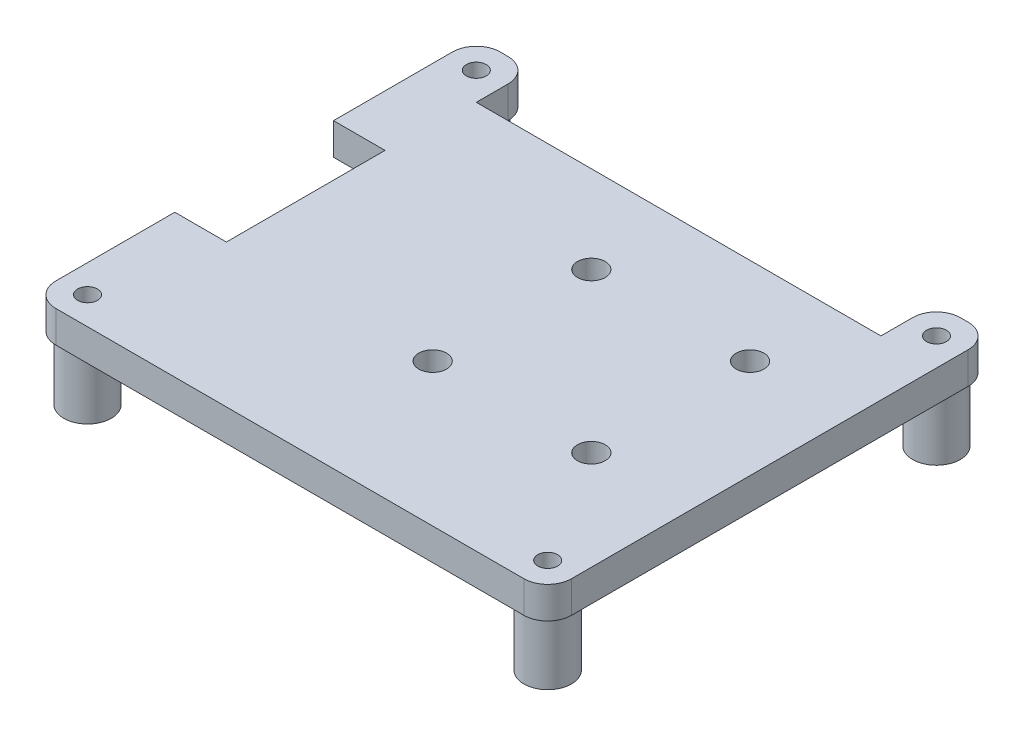
ISO-10303-21;
HEADER;
FILE_DESCRIPTION(('STEP AP214'),'2;1');
FILE_NAME('part.step','',(''),(''),'','','');
FILE_SCHEMA(('AUTOMOTIVE_DESIGN { 1 0 10303 214 1 1 1 1 }'));
ENDSEC;
DATA;
#1=APPLICATION_CONTEXT('core data for automotive mechanical design processes');
#2=APPLICATION_PROTOCOL_DEFINITION('international standard','automotive_design',2000,#1);
#3=PRODUCT_CONTEXT('',#1,'mechanical');
#4=PRODUCT('Part','Part','',(#3));
#5=PRODUCT_RELATED_PRODUCT_CATEGORY('part','',(#4));
#6=PRODUCT_DEFINITION_FORMATION('','',#4);
#7=PRODUCT_DEFINITION_CONTEXT('part definition',#1,'design');
#8=PRODUCT_DEFINITION('design','',#6,#7);
#9=PRODUCT_DEFINITION_SHAPE('','',#8);
#10=(LENGTH_UNIT() NAMED_UNIT(*) SI_UNIT(.MILLI.,.METRE.));
#11=(NAMED_UNIT(*) PLANE_ANGLE_UNIT() SI_UNIT($,.RADIAN.));
#12=(NAMED_UNIT(*) SI_UNIT($,.STERADIAN.) SOLID_ANGLE_UNIT());
#13=UNCERTAINTY_MEASURE_WITH_UNIT(LENGTH_MEASURE(1.E-05),#10,'distance_accuracy_value','');
#14=(GEOMETRIC_REPRESENTATION_CONTEXT(3) GLOBAL_UNCERTAINTY_ASSIGNED_CONTEXT((#13)) GLOBAL_UNIT_ASSIGNED_CONTEXT((#10,
#11,#12)) REPRESENTATION_CONTEXT('',''));
#15=CARTESIAN_POINT('',(0.,0.,0.));
#16=DIRECTION('',(0.,0.,1.));
#17=DIRECTION('',(1.,0.,0.));
#18=AXIS2_PLACEMENT_3D('',#15,#16,#17);
#19=CARTESIAN_POINT('',(0.,0.,0.));
#20=DIRECTION('',(0.,-1.,0.));
#21=DIRECTION('',(0.,0.,-1.));
#22=AXIS2_PLACEMENT_3D('',#19,#20,#21);
#23=PLANE('',#22);
#24=CARTESIAN_POINT('',(32.3632285890982,0.,-28.7197204695631));
#25=DIRECTION('',(0.,-1.,0.));
#26=DIRECTION('',(0.,0.,-1.));
#27=AXIS2_PLACEMENT_3D('',#24,#25,#26);
#28=CIRCLE('',#27,3.);
#29=CARTESIAN_POINT('',(32.3632285890982,0.,-31.7197204695631));
#30=VERTEX_POINT('',#29);
#31=EDGE_CURVE('E454',#30,#30,#28,.T.);
#32=ORIENTED_EDGE('',*,*,#31,.F.);
#33=EDGE_LOOP('',(#32));
#34=FACE_BOUND('',#33,.T.);
#35=CARTESIAN_POINT('',(-25.6367714109018,0.,20.2802795304369));
#36=DIRECTION('',(0.,-1.,0.));
#37=DIRECTION('',(0.,0.,-1.));
#38=AXIS2_PLACEMENT_3D('',#35,#36,#37);
#39=CIRCLE('',#38,3.);
#40=CARTESIAN_POINT('',(-25.6367714109018,0.,17.2802795304369));
#41=VERTEX_POINT('',#40);
#42=EDGE_CURVE('E427',#41,#41,#39,.T.);
#43=ORIENTED_EDGE('',*,*,#42,.F.);
#44=EDGE_LOOP('',(#43));
#45=FACE_BOUND('',#44,.T.);
#46=CARTESIAN_POINT('',(23.3632285890982,0.,5.78027953043689));
#47=DIRECTION('',(0.,1.,0.));
#48=DIRECTION('',(0.,0.,1.));
#49=AXIS2_PLACEMENT_3D('',#46,#47,#48);
#50=CIRCLE('',#49,1.75);
#51=CARTESIAN_POINT('',(23.3632285890982,0.,7.53027953043689));
#52=VERTEX_POINT('',#51);
#53=EDGE_CURVE('E403',#52,#52,#50,.T.);
#54=ORIENTED_EDGE('',*,*,#53,.T.);
#55=EDGE_LOOP('',(#54));
#56=FACE_BOUND('',#55,.T.);
#57=CARTESIAN_POINT('',(3.36322858909823,0.,5.7802795304369));
#58=DIRECTION('',(0.,1.,0.));
#59=DIRECTION('',(0.,0.,1.));
#60=AXIS2_PLACEMENT_3D('',#57,#58,#59);
#61=CIRCLE('',#60,1.75);
#62=CARTESIAN_POINT('',(3.36322858909823,0.,7.5302795304369));
#63=VERTEX_POINT('',#62);
#64=EDGE_CURVE('E412',#63,#63,#61,.T.);
#65=ORIENTED_EDGE('',*,*,#64,.T.);
#66=EDGE_LOOP('',(#65));
#67=FACE_BOUND('',#66,.T.);
#68=CARTESIAN_POINT('',(3.36322858909823,0.,-14.2197204695631));
#69=DIRECTION('',(0.,1.,0.));
#70=DIRECTION('',(0.,0.,1.));
#71=AXIS2_PLACEMENT_3D('',#68,#69,#70);
#72=CIRCLE('',#71,1.75);
#73=CARTESIAN_POINT('',(3.36322858909823,0.,-12.4697204695631));
#74=VERTEX_POINT('',#73);
#75=EDGE_CURVE('E420',#74,#74,#72,.T.);
#76=ORIENTED_EDGE('',*,*,#75,.T.);
#77=EDGE_LOOP('',(#76));
#78=FACE_BOUND('',#77,.T.);
#79=CARTESIAN_POINT('',(23.3632285890982,0.,-14.2197204695631));
#80=DIRECTION('',(0.,1.,0.));
#81=DIRECTION('',(0.,0.,1.));
#82=AXIS2_PLACEMENT_3D('',#79,#80,#81);
#83=CIRCLE('',#82,1.75);
#84=CARTESIAN_POINT('',(23.3632285890982,0.,-12.4697204695631));
#85=VERTEX_POINT('',#84);
#86=EDGE_CURVE('E394',#85,#85,#83,.T.);
#87=ORIENTED_EDGE('',*,*,#86,.T.);
#88=EDGE_LOOP('',(#87));
#89=FACE_BOUND('',#88,.T.);
#90=DIRECTION('',(0.,0.,1.));
#91=VECTOR('',#90,1.);
#92=CARTESIAN_POINT('',(28.8632285890982,0.,-32.2197204695631));
#93=LINE('',#92,#91);
#94=CARTESIAN_POINT('',(28.8632285890982,0.,-29.2197204695631));
#95=VERTEX_POINT('',#94);
#96=CARTESIAN_POINT('',(28.8632285890982,0.,-25.2197204695631));
#97=VERTEX_POINT('',#96);
#98=EDGE_CURVE('E270',#95,#97,#93,.T.);
#99=ORIENTED_EDGE('',*,*,#98,.F.);
#100=CARTESIAN_POINT('',(31.8632285890982,0.,-29.2197204695631));
#101=DIRECTION('',(0.,-1.,0.));
#102=DIRECTION('',(0.,0.,-1.));
#103=AXIS2_PLACEMENT_3D('',#100,#101,#102);
#104=CIRCLE('',#103,3.);
#105=CARTESIAN_POINT('',(31.8632285890982,0.,-32.2197204695631));
#106=VERTEX_POINT('',#105);
#107=EDGE_CURVE('E314',#95,#106,#104,.T.);
#108=ORIENTED_EDGE('',*,*,#107,.T.);
#109=DIRECTION('',(-1.,0.,0.));
#110=VECTOR('',#109,1.);
#111=CARTESIAN_POINT('',(35.8632285890982,0.,-32.2197204695631));
#112=LINE('',#111,#110);
#113=CARTESIAN_POINT('',(32.8632285890982,0.,-32.2197204695631));
#114=VERTEX_POINT('',#113);
#115=EDGE_CURVE('E266',#114,#106,#112,.T.);
#116=ORIENTED_EDGE('',*,*,#115,.F.);
#117=CARTESIAN_POINT('',(32.8632285890982,0.,-29.2197204695631));
#118=DIRECTION('',(0.,-1.,0.));
#119=DIRECTION('',(0.,0.,-1.));
#120=AXIS2_PLACEMENT_3D('',#117,#118,#119);
#121=CIRCLE('',#120,3.);
#122=CARTESIAN_POINT('',(35.8632285890982,0.,-29.2197204695631));
#123=VERTEX_POINT('',#122);
#124=EDGE_CURVE('E311',#114,#123,#121,.T.);
#125=ORIENTED_EDGE('',*,*,#124,.T.);
#126=DIRECTION('',(0.,0.,-1.));
#127=VECTOR('',#126,1.);
#128=CARTESIAN_POINT('',(35.8632285890982,0.,23.7802795304369));
#129=LINE('',#128,#127);
#130=CARTESIAN_POINT('',(35.8632285890982,0.,20.7802795304369));
#131=VERTEX_POINT('',#130);
#132=EDGE_CURVE('E263',#131,#123,#129,.T.);
#133=ORIENTED_EDGE('',*,*,#132,.F.);
#134=CARTESIAN_POINT('',(32.8632285890982,0.,20.7802795304369));
#135=DIRECTION('',(0.,-1.,0.));
#136=DIRECTION('',(0.,0.,-1.));
#137=AXIS2_PLACEMENT_3D('',#134,#135,#136);
#138=CIRCLE('',#137,3.);
#139=CARTESIAN_POINT('',(32.8632285890982,0.,23.7802795304369));
#140=VERTEX_POINT('',#139);
#141=EDGE_CURVE('E308',#131,#140,#138,.T.);
#142=ORIENTED_EDGE('',*,*,#141,.T.);
#143=DIRECTION('',(1.,0.,0.));
#144=VECTOR('',#143,1.);
#145=CARTESIAN_POINT('',(35.8632285890982,0.,23.7802795304369));
#146=LINE('',#145,#144);
#147=CARTESIAN_POINT('',(-26.1367714109018,0.,23.7802795304369));
#148=VERTEX_POINT('',#147);
#149=EDGE_CURVE('E259',#148,#140,#146,.T.);
#150=ORIENTED_EDGE('',*,*,#149,.F.);
#151=CARTESIAN_POINT('',(-26.1367714109018,0.,20.7802795304369));
#152=DIRECTION('',(0.,-1.,0.));
#153=DIRECTION('',(0.,0.,-1.));
#154=AXIS2_PLACEMENT_3D('',#151,#152,#153);
#155=CIRCLE('',#154,3.);
#156=CARTESIAN_POINT('',(-29.1367714109018,0.,20.7802795304369));
#157=VERTEX_POINT('',#156);
#158=EDGE_CURVE('E305',#148,#157,#155,.T.);
#159=ORIENTED_EDGE('',*,*,#158,.T.);
#160=DIRECTION('',(0.,0.,1.));
#161=VECTOR('',#160,1.);
#162=CARTESIAN_POINT('',(-29.1367714109018,0.,23.7802795304369));
#163=LINE('',#162,#161);
#164=CARTESIAN_POINT('',(-29.1367714109018,0.,5.78027953043692));
#165=VERTEX_POINT('',#164);
#166=EDGE_CURVE('E255',#165,#157,#163,.T.);
#167=ORIENTED_EDGE('',*,*,#166,.F.);
#168=DIRECTION('',(-1.,0.,0.));
#169=VECTOR('',#168,1.);
#170=CARTESIAN_POINT('',(-29.1367714109018,0.,5.78027953043692));
#171=LINE('',#170,#169);
#172=CARTESIAN_POINT('',(-22.6367714109018,0.,5.78027953043692));
#173=VERTEX_POINT('',#172);
#174=EDGE_CURVE('E252',#173,#165,#171,.T.);
#175=ORIENTED_EDGE('',*,*,#174,.F.);
#176=DIRECTION('',(0.,0.,1.));
#177=VECTOR('',#176,1.);
#178=CARTESIAN_POINT('',(-22.6367714109018,0.,-14.2197204695631));
#179=LINE('',#178,#177);
#180=CARTESIAN_POINT('',(-22.6367714109018,0.,-14.2197204695631));
#181=VERTEX_POINT('',#180);
#182=EDGE_CURVE('E249',#181,#173,#179,.T.);
#183=ORIENTED_EDGE('',*,*,#182,.F.);
#184=DIRECTION('',(1.,0.,0.));
#185=VECTOR('',#184,1.);
#186=CARTESIAN_POINT('',(-29.1367714109018,0.,-14.2197204695631));
#187=LINE('',#186,#185);
#188=CARTESIAN_POINT('',(-29.1367714109018,0.,-14.2197204695631));
#189=VERTEX_POINT('',#188);
#190=EDGE_CURVE('E246',#189,#181,#187,.T.);
#191=ORIENTED_EDGE('',*,*,#190,.F.);
#192=DIRECTION('',(0.,0.,1.));
#193=VECTOR('',#192,1.);
#194=CARTESIAN_POINT('',(-29.1367714109018,0.,-14.2197204695631));
#195=LINE('',#194,#193);
#196=CARTESIAN_POINT('',(-29.1367714109018,0.,-29.2197204695631));
#197=VERTEX_POINT('',#196);
#198=EDGE_CURVE('E195',#197,#189,#195,.T.);
#199=ORIENTED_EDGE('',*,*,#198,.F.);
#200=CARTESIAN_POINT('',(-26.1367714109018,0.,-29.2197204695631));
#201=DIRECTION('',(0.,-1.,0.));
#202=DIRECTION('',(0.,0.,-1.));
#203=AXIS2_PLACEMENT_3D('',#200,#201,#202);
#204=CIRCLE('',#203,3.);
#205=CARTESIAN_POINT('',(-26.1367714109018,0.,-32.2197204695631));
#206=VERTEX_POINT('',#205);
#207=EDGE_CURVE('E299',#197,#206,#204,.T.);
#208=ORIENTED_EDGE('',*,*,#207,.T.);
#209=DIRECTION('',(-1.,0.,0.));
#210=VECTOR('',#209,1.);
#211=CARTESIAN_POINT('',(-22.1367714109018,0.,-32.2197204695631));
#212=LINE('',#211,#210);
#213=CARTESIAN_POINT('',(-25.1367714109018,0.,-32.2197204695631));
#214=VERTEX_POINT('',#213);
#215=EDGE_CURVE('E239',#214,#206,#212,.T.);
#216=ORIENTED_EDGE('',*,*,#215,.F.);
#217=CARTESIAN_POINT('',(-25.1367714109018,0.,-29.2197204695631));
#218=DIRECTION('',(0.,-1.,0.));
#219=DIRECTION('',(0.,0.,-1.));
#220=AXIS2_PLACEMENT_3D('',#217,#218,#219);
#221=CIRCLE('',#220,3.);
#222=CARTESIAN_POINT('',(-22.1367714109018,0.,-29.2197204695631));
#223=VERTEX_POINT('',#222);
#224=EDGE_CURVE('E302',#214,#223,#221,.T.);
#225=ORIENTED_EDGE('',*,*,#224,.T.);
#226=DIRECTION('',(0.,0.,-1.));
#227=VECTOR('',#226,1.);
#228=CARTESIAN_POINT('',(-22.1367714109018,0.,-32.2197204695631));
#229=LINE('',#228,#227);
#230=CARTESIAN_POINT('',(-22.1367714109018,0.,-25.2197204695631));
#231=VERTEX_POINT('',#230);
#232=EDGE_CURVE('E276',#231,#223,#229,.T.);
#233=ORIENTED_EDGE('',*,*,#232,.F.);
#234=DIRECTION('',(-1.,0.,0.));
#235=VECTOR('',#234,1.);
#236=CARTESIAN_POINT('',(-22.1367714109018,0.,-25.2197204695631));
#237=LINE('',#236,#235);
#238=EDGE_CURVE('E273',#97,#231,#237,.T.);
#239=ORIENTED_EDGE('',*,*,#238,.F.);
#240=EDGE_LOOP('',(#99,#108,#116,#125,#133,#142,#150,#159,#167,#175,#183,#191,#199,#208,#216,
#225,#233,#239));
#241=FACE_BOUND('',#240,.T.);
#242=CARTESIAN_POINT('',(-25.6367714109018,0.,-28.7197204695631));
#243=DIRECTION('',(0.,-1.,0.));
#244=DIRECTION('',(0.,0.,-1.));
#245=AXIS2_PLACEMENT_3D('',#242,#243,#244);
#246=CIRCLE('',#245,3.);
#247=CARTESIAN_POINT('',(-25.6367714109018,0.,-31.7197204695631));
#248=VERTEX_POINT('',#247);
#249=EDGE_CURVE('E442',#248,#248,#246,.T.);
#250=ORIENTED_EDGE('',*,*,#249,.F.);
#251=EDGE_LOOP('',(#250));
#252=FACE_BOUND('',#251,.T.);
#253=CARTESIAN_POINT('',(32.3632285890982,0.,20.2802795304369));
#254=DIRECTION('',(0.,-1.,0.));
#255=DIRECTION('',(0.,0.,-1.));
#256=AXIS2_PLACEMENT_3D('',#253,#254,#255);
#257=CIRCLE('',#256,3.);
#258=CARTESIAN_POINT('',(32.3632285890982,0.,17.2802795304369));
#259=VERTEX_POINT('',#258);
#260=EDGE_CURVE('E466',#259,#259,#257,.T.);
#261=ORIENTED_EDGE('',*,*,#260,.F.);
#262=EDGE_LOOP('',(#261));
#263=FACE_BOUND('',#262,.T.);
#264=ADVANCED_FACE('F47',(#34,#45,#56,#67,#78,#89,#241,#252,#263),#23,.T.);
#265=CARTESIAN_POINT('',(0.,4.,0.));
#266=DIRECTION('',(0.,-1.,0.));
#267=DIRECTION('',(0.,0.,-1.));
#268=AXIS2_PLACEMENT_3D('',#265,#266,#267);
#269=PLANE('',#268);
#270=CARTESIAN_POINT('',(23.3632285890982,4.,5.78027953043689));
#271=DIRECTION('',(0.,1.,0.));
#272=DIRECTION('',(0.,0.,1.));
#273=AXIS2_PLACEMENT_3D('',#270,#271,#272);
#274=CIRCLE('',#273,1.75);
#275=CARTESIAN_POINT('',(23.3632285890982,4.,7.53027953043689));
#276=VERTEX_POINT('',#275);
#277=EDGE_CURVE('E407',#276,#276,#274,.T.);
#278=ORIENTED_EDGE('',*,*,#277,.F.);
#279=EDGE_LOOP('',(#278));
#280=FACE_BOUND('',#279,.T.);
#281=CARTESIAN_POINT('',(3.36322858909823,4.,5.7802795304369));
#282=DIRECTION('',(0.,1.,0.));
#283=DIRECTION('',(0.,0.,1.));
#284=AXIS2_PLACEMENT_3D('',#281,#282,#283);
#285=CIRCLE('',#284,1.75);
#286=CARTESIAN_POINT('',(3.36322858909823,4.,7.5302795304369));
#287=VERTEX_POINT('',#286);
#288=EDGE_CURVE('E416',#287,#287,#285,.T.);
#289=ORIENTED_EDGE('',*,*,#288,.F.);
#290=EDGE_LOOP('',(#289));
#291=FACE_BOUND('',#290,.T.);
#292=CARTESIAN_POINT('',(3.36322858909823,4.,-14.2197204695631));
#293=DIRECTION('',(0.,1.,0.));
#294=DIRECTION('',(0.,0.,1.));
#295=AXIS2_PLACEMENT_3D('',#292,#293,#294);
#296=CIRCLE('',#295,1.75);
#297=CARTESIAN_POINT('',(3.36322858909823,4.,-12.4697204695631));
#298=VERTEX_POINT('',#297);
#299=EDGE_CURVE('E399',#298,#298,#296,.T.);
#300=ORIENTED_EDGE('',*,*,#299,.F.);
#301=EDGE_LOOP('',(#300));
#302=FACE_BOUND('',#301,.T.);
#303=CARTESIAN_POINT('',(23.3632285890982,4.,-14.2197204695631));
#304=DIRECTION('',(0.,1.,0.));
#305=DIRECTION('',(0.,0.,1.));
#306=AXIS2_PLACEMENT_3D('',#303,#304,#305);
#307=CIRCLE('',#306,1.75);
#308=CARTESIAN_POINT('',(23.3632285890982,4.,-12.4697204695631));
#309=VERTEX_POINT('',#308);
#310=EDGE_CURVE('E395',#309,#309,#307,.T.);
#311=ORIENTED_EDGE('',*,*,#310,.F.);
#312=EDGE_LOOP('',(#311));
#313=FACE_BOUND('',#312,.T.);
#314=DIRECTION('',(-1.,0.,0.));
#315=VECTOR('',#314,1.);
#316=CARTESIAN_POINT('',(35.8632285890982,4.,-32.2197204695631));
#317=LINE('',#316,#315);
#318=CARTESIAN_POINT('',(32.8632285890982,4.,-32.2197204695631));
#319=VERTEX_POINT('',#318);
#320=CARTESIAN_POINT('',(31.8632285890982,4.,-32.2197204695631));
#321=VERTEX_POINT('',#320);
#322=EDGE_CURVE('E226',#319,#321,#317,.T.);
#323=ORIENTED_EDGE('',*,*,#322,.T.);
#324=CARTESIAN_POINT('',(31.8632285890982,4.,-29.2197204695631));
#325=DIRECTION('',(0.,-1.,0.));
#326=DIRECTION('',(0.,0.,-1.));
#327=AXIS2_PLACEMENT_3D('',#324,#325,#326);
#328=CIRCLE('',#327,3.);
#329=CARTESIAN_POINT('',(28.8632285890982,4.,-29.2197204695631));
#330=VERTEX_POINT('',#329);
#331=EDGE_CURVE('E338',#321,#330,#328,.F.);
#332=ORIENTED_EDGE('',*,*,#331,.T.);
#333=DIRECTION('',(0.,0.,1.));
#334=VECTOR('',#333,1.);
#335=CARTESIAN_POINT('',(28.8632285890982,4.,-32.2197204695631));
#336=LINE('',#335,#334);
#337=CARTESIAN_POINT('',(28.8632285890982,4.,-25.2197204695631));
#338=VERTEX_POINT('',#337);
#339=EDGE_CURVE('E229',#330,#338,#336,.T.);
#340=ORIENTED_EDGE('',*,*,#339,.T.);
#341=DIRECTION('',(-1.,0.,0.));
#342=VECTOR('',#341,1.);
#343=CARTESIAN_POINT('',(-22.1367714109018,4.,-25.2197204695631));
#344=LINE('',#343,#342);
#345=CARTESIAN_POINT('',(-22.1367714109018,4.,-25.2197204695631));
#346=VERTEX_POINT('',#345);
#347=EDGE_CURVE('E232',#338,#346,#344,.T.);
#348=ORIENTED_EDGE('',*,*,#347,.T.);
#349=DIRECTION('',(0.,0.,-1.));
#350=VECTOR('',#349,1.);
#351=CARTESIAN_POINT('',(-22.1367714109018,4.,-32.2197204695631));
#352=LINE('',#351,#350);
#353=CARTESIAN_POINT('',(-22.1367714109018,4.,-29.2197204695631));
#354=VERTEX_POINT('',#353);
#355=EDGE_CURVE('E235',#346,#354,#352,.T.);
#356=ORIENTED_EDGE('',*,*,#355,.T.);
#357=CARTESIAN_POINT('',(-25.1367714109018,4.,-29.2197204695631));
#358=DIRECTION('',(0.,-1.,0.));
#359=DIRECTION('',(0.,0.,-1.));
#360=AXIS2_PLACEMENT_3D('',#357,#358,#359);
#361=CIRCLE('',#360,3.);
#362=CARTESIAN_POINT('',(-25.1367714109018,4.,-32.2197204695631));
#363=VERTEX_POINT('',#362);
#364=EDGE_CURVE('E326',#354,#363,#361,.F.);
#365=ORIENTED_EDGE('',*,*,#364,.T.);
#366=DIRECTION('',(-1.,0.,0.));
#367=VECTOR('',#366,1.);
#368=CARTESIAN_POINT('',(-22.1367714109018,4.,-32.2197204695631));
#369=LINE('',#368,#367);
#370=CARTESIAN_POINT('',(-26.1367714109018,4.,-32.2197204695631));
#371=VERTEX_POINT('',#370);
#372=EDGE_CURVE('E189',#363,#371,#369,.T.);
#373=ORIENTED_EDGE('',*,*,#372,.T.);
#374=CARTESIAN_POINT('',(-26.1367714109018,4.,-29.2197204695631));
#375=DIRECTION('',(0.,-1.,0.));
#376=DIRECTION('',(0.,0.,-1.));
#377=AXIS2_PLACEMENT_3D('',#374,#375,#376);
#378=CIRCLE('',#377,3.);
#379=CARTESIAN_POINT('',(-29.1367714109018,4.,-29.2197204695631));
#380=VERTEX_POINT('',#379);
#381=EDGE_CURVE('E185',#371,#380,#378,.F.);
#382=ORIENTED_EDGE('',*,*,#381,.T.);
#383=DIRECTION('',(0.,0.,1.));
#384=VECTOR('',#383,1.);
#385=CARTESIAN_POINT('',(-29.1367714109018,4.,-14.2197204695631));
#386=LINE('',#385,#384);
#387=CARTESIAN_POINT('',(-29.1367714109018,4.,-14.2197204695631));
#388=VERTEX_POINT('',#387);
#389=EDGE_CURVE('E175',#380,#388,#386,.T.);
#390=ORIENTED_EDGE('',*,*,#389,.T.);
#391=DIRECTION('',(1.,0.,0.));
#392=VECTOR('',#391,1.);
#393=CARTESIAN_POINT('',(-29.1367714109018,4.,-14.2197204695631));
#394=LINE('',#393,#392);
#395=CARTESIAN_POINT('',(-22.6367714109018,4.,-14.2197204695631));
#396=VERTEX_POINT('',#395);
#397=EDGE_CURVE('E181',#388,#396,#394,.T.);
#398=ORIENTED_EDGE('',*,*,#397,.T.);
#399=DIRECTION('',(0.,0.,1.));
#400=VECTOR('',#399,1.);
#401=CARTESIAN_POINT('',(-22.6367714109018,4.,-14.2197204695631));
#402=LINE('',#401,#400);
#403=CARTESIAN_POINT('',(-22.6367714109018,4.,5.78027953043692));
#404=VERTEX_POINT('',#403);
#405=EDGE_CURVE('E206',#396,#404,#402,.T.);
#406=ORIENTED_EDGE('',*,*,#405,.T.);
#407=DIRECTION('',(-1.,0.,0.));
#408=VECTOR('',#407,1.);
#409=CARTESIAN_POINT('',(-29.1367714109018,4.,5.78027953043692));
#410=LINE('',#409,#408);
#411=CARTESIAN_POINT('',(-29.1367714109018,4.,5.78027953043692));
#412=VERTEX_POINT('',#411);
#413=EDGE_CURVE('E209',#404,#412,#410,.T.);
#414=ORIENTED_EDGE('',*,*,#413,.T.);
#415=DIRECTION('',(0.,0.,1.));
#416=VECTOR('',#415,1.);
#417=CARTESIAN_POINT('',(-29.1367714109018,4.,23.7802795304369));
#418=LINE('',#417,#416);
#419=CARTESIAN_POINT('',(-29.1367714109018,4.,20.7802795304369));
#420=VERTEX_POINT('',#419);
#421=EDGE_CURVE('E215',#412,#420,#418,.T.);
#422=ORIENTED_EDGE('',*,*,#421,.T.);
#423=CARTESIAN_POINT('',(-26.1367714109018,4.,20.7802795304369));
#424=DIRECTION('',(0.,-1.,0.));
#425=DIRECTION('',(0.,0.,-1.));
#426=AXIS2_PLACEMENT_3D('',#423,#424,#425);
#427=CIRCLE('',#426,3.);
#428=CARTESIAN_POINT('',(-26.1367714109018,4.,23.7802795304369));
#429=VERTEX_POINT('',#428);
#430=EDGE_CURVE('E329',#420,#429,#427,.F.);
#431=ORIENTED_EDGE('',*,*,#430,.T.);
#432=DIRECTION('',(1.,0.,0.));
#433=VECTOR('',#432,1.);
#434=CARTESIAN_POINT('',(35.8632285890982,4.,23.7802795304369));
#435=LINE('',#434,#433);
#436=CARTESIAN_POINT('',(32.8632285890982,4.,23.7802795304369));
#437=VERTEX_POINT('',#436);
#438=EDGE_CURVE('E219',#429,#437,#435,.T.);
#439=ORIENTED_EDGE('',*,*,#438,.T.);
#440=CARTESIAN_POINT('',(32.8632285890982,4.,20.7802795304369));
#441=DIRECTION('',(0.,-1.,0.));
#442=DIRECTION('',(0.,0.,-1.));
#443=AXIS2_PLACEMENT_3D('',#440,#441,#442);
#444=CIRCLE('',#443,3.);
#445=CARTESIAN_POINT('',(35.8632285890982,4.,20.7802795304369));
#446=VERTEX_POINT('',#445);
#447=EDGE_CURVE('E332',#437,#446,#444,.F.);
#448=ORIENTED_EDGE('',*,*,#447,.T.);
#449=DIRECTION('',(0.,0.,-1.));
#450=VECTOR('',#449,1.);
#451=CARTESIAN_POINT('',(35.8632285890982,4.,23.7802795304369));
#452=LINE('',#451,#450);
#453=CARTESIAN_POINT('',(35.8632285890982,4.,-29.2197204695631));
#454=VERTEX_POINT('',#453);
#455=EDGE_CURVE('E223',#446,#454,#452,.T.);
#456=ORIENTED_EDGE('',*,*,#455,.T.);
#457=CARTESIAN_POINT('',(32.8632285890982,4.,-29.2197204695631));
#458=DIRECTION('',(0.,-1.,0.));
#459=DIRECTION('',(0.,0.,-1.));
#460=AXIS2_PLACEMENT_3D('',#457,#458,#459);
#461=CIRCLE('',#460,3.);
#462=EDGE_CURVE('E335',#454,#319,#461,.F.);
#463=ORIENTED_EDGE('',*,*,#462,.T.);
#464=EDGE_LOOP('',(#323,#332,#340,#348,#356,#365,#373,#382,#390,#398,#406,#414,#422,#431,#439,
#448,#456,#463));
#465=FACE_BOUND('',#464,.T.);
#466=CARTESIAN_POINT('',(32.3632285890982,4.,-28.7197204695631));
#467=DIRECTION('',(0.,1.,0.));
#468=DIRECTION('',(0.,0.,1.));
#469=AXIS2_PLACEMENT_3D('',#466,#467,#468);
#470=CIRCLE('',#469,1.25);
#471=CARTESIAN_POINT('',(32.3632285890982,4.,-27.4697204695631));
#472=VERTEX_POINT('',#471);
#473=EDGE_CURVE('E243',#472,#472,#470,.T.);
#474=ORIENTED_EDGE('',*,*,#473,.F.);
#475=EDGE_LOOP('',(#474));
#476=FACE_BOUND('',#475,.T.);
#477=CARTESIAN_POINT('',(-25.6367714109018,4.,-28.7197204695631));
#478=DIRECTION('',(0.,1.,0.));
#479=DIRECTION('',(0.,0.,1.));
#480=AXIS2_PLACEMENT_3D('',#477,#478,#479);
#481=CIRCLE('',#480,1.25);
#482=CARTESIAN_POINT('',(-25.6367714109018,4.,-27.4697204695631));
#483=VERTEX_POINT('',#482);
#484=EDGE_CURVE('E382',#483,#483,#481,.T.);
#485=ORIENTED_EDGE('',*,*,#484,.F.);
#486=EDGE_LOOP('',(#485));
#487=FACE_BOUND('',#486,.T.);
#488=CARTESIAN_POINT('',(32.3632285890982,4.,20.2802795304369));
#489=DIRECTION('',(0.,1.,0.));
#490=DIRECTION('',(0.,0.,1.));
#491=AXIS2_PLACEMENT_3D('',#488,#489,#490);
#492=CIRCLE('',#491,1.25);
#493=CARTESIAN_POINT('',(32.3632285890982,4.,21.5302795304369));
#494=VERTEX_POINT('',#493);
#495=EDGE_CURVE('E386',#494,#494,#492,.T.);
#496=ORIENTED_EDGE('',*,*,#495,.F.);
#497=EDGE_LOOP('',(#496));
#498=FACE_BOUND('',#497,.T.);
#499=CARTESIAN_POINT('',(-25.6367714109018,4.,20.2802795304369));
#500=DIRECTION('',(0.,1.,0.));
#501=DIRECTION('',(0.,0.,1.));
#502=AXIS2_PLACEMENT_3D('',#499,#500,#501);
#503=CIRCLE('',#502,1.25);
#504=CARTESIAN_POINT('',(-25.6367714109018,4.,21.5302795304369));
#505=VERTEX_POINT('',#504);
#506=EDGE_CURVE('E390',#505,#505,#503,.T.);
#507=ORIENTED_EDGE('',*,*,#506,.F.);
#508=EDGE_LOOP('',(#507));
#509=FACE_BOUND('',#508,.T.);
#510=ADVANCED_FACE('F178',(#280,#291,#302,#313,#465,#476,#487,#498,#509),#269,.F.);
#511=CARTESIAN_POINT('',(-22.1367714109018,4.,-32.2197204695631));
#512=DIRECTION('',(0.,0.,1.));
#513=DIRECTION('',(1.,0.,0.));
#514=AXIS2_PLACEMENT_3D('',#511,#512,#513);
#515=PLANE('',#514);
#516=ORIENTED_EDGE('',*,*,#372,.F.);
#517=DIRECTION('',(0.,-1.,0.));
#518=VECTOR('',#517,1.);
#519=CARTESIAN_POINT('',(-25.1367714109018,4.,-32.2197204695631));
#520=LINE('',#519,#518);
#521=EDGE_CURVE('E360',#363,#214,#520,.T.);
#522=ORIENTED_EDGE('',*,*,#521,.T.);
#523=ORIENTED_EDGE('',*,*,#215,.T.);
#524=DIRECTION('',(0.,-1.,0.));
#525=VECTOR('',#524,1.);
#526=CARTESIAN_POINT('',(-26.1367714109018,4.,-32.2197204695631));
#527=LINE('',#526,#525);
#528=EDGE_CURVE('E357',#206,#371,#527,.F.);
#529=ORIENTED_EDGE('',*,*,#528,.T.);
#530=EDGE_LOOP('',(#516,#522,#523,#529));
#531=FACE_BOUND('',#530,.T.);
#532=ADVANCED_FACE('F368',(#531),#515,.F.);
#533=CARTESIAN_POINT('',(-29.1367714109018,4.,-14.2197204695631));
#534=DIRECTION('',(1.,0.,0.));
#535=DIRECTION('',(0.,0.,-1.));
#536=AXIS2_PLACEMENT_3D('',#533,#534,#535);
#537=PLANE('',#536);
#538=ORIENTED_EDGE('',*,*,#389,.F.);
#539=DIRECTION('',(0.,-1.,0.));
#540=VECTOR('',#539,1.);
#541=CARTESIAN_POINT('',(-29.1367714109018,4.,-29.2197204695631));
#542=LINE('',#541,#540);
#543=EDGE_CURVE('E11',#380,#197,#542,.T.);
#544=ORIENTED_EDGE('',*,*,#543,.T.);
#545=ORIENTED_EDGE('',*,*,#198,.T.);
#546=DIRECTION('',(0.,-1.,0.));
#547=VECTOR('',#546,1.);
#548=CARTESIAN_POINT('',(-29.1367714109018,4.,-14.2197204695631));
#549=LINE('',#548,#547);
#550=EDGE_CURVE('E192',#388,#189,#549,.T.);
#551=ORIENTED_EDGE('',*,*,#550,.F.);
#552=EDGE_LOOP('',(#538,#544,#545,#551));
#553=FACE_BOUND('',#552,.T.);
#554=ADVANCED_FACE('F193',(#553),#537,.F.);
#555=CARTESIAN_POINT('',(-29.1367714109018,4.,-14.2197204695631));
#556=DIRECTION('',(0.,0.,-1.));
#557=DIRECTION('',(-1.,0.,0.));
#558=AXIS2_PLACEMENT_3D('',#555,#556,#557);
#559=PLANE('',#558);
#560=ORIENTED_EDGE('',*,*,#190,.T.);
#561=DIRECTION('',(0.,-1.,0.));
#562=VECTOR('',#561,1.);
#563=CARTESIAN_POINT('',(-22.6367714109018,4.,-14.2197204695631));
#564=LINE('',#563,#562);
#565=EDGE_CURVE('E200',#396,#181,#564,.T.);
#566=ORIENTED_EDGE('',*,*,#565,.F.);
#567=ORIENTED_EDGE('',*,*,#397,.F.);
#568=ORIENTED_EDGE('',*,*,#550,.T.);
#569=EDGE_LOOP('',(#560,#566,#567,#568));
#570=FACE_BOUND('',#569,.T.);
#571=ADVANCED_FACE('F202',(#570),#559,.F.);
#572=CARTESIAN_POINT('',(-22.6367714109018,4.,-14.2197204695631));
#573=DIRECTION('',(1.,0.,0.));
#574=DIRECTION('',(0.,0.,-1.));
#575=AXIS2_PLACEMENT_3D('',#572,#573,#574);
#576=PLANE('',#575);
#577=ORIENTED_EDGE('',*,*,#182,.T.);
#578=DIRECTION('',(0.,-1.,0.));
#579=VECTOR('',#578,1.);
#580=CARTESIAN_POINT('',(-22.6367714109018,4.,5.78027953043692));
#581=LINE('',#580,#579);
#582=EDGE_CURVE('E290',#404,#173,#581,.T.);
#583=ORIENTED_EDGE('',*,*,#582,.F.);
#584=ORIENTED_EDGE('',*,*,#405,.F.);
#585=ORIENTED_EDGE('',*,*,#565,.T.);
#586=EDGE_LOOP('',(#577,#583,#584,#585));
#587=FACE_BOUND('',#586,.T.);
#588=ADVANCED_FACE('F521',(#587),#576,.F.);
#589=CARTESIAN_POINT('',(-29.1367714109018,4.,5.78027953043692));
#590=DIRECTION('',(0.,0.,1.));
#591=DIRECTION('',(1.,0.,0.));
#592=AXIS2_PLACEMENT_3D('',#589,#590,#591);
#593=PLANE('',#592);
#594=ORIENTED_EDGE('',*,*,#174,.T.);
#595=DIRECTION('',(0.,-1.,0.));
#596=VECTOR('',#595,1.);
#597=CARTESIAN_POINT('',(-29.1367714109018,4.,5.78027953043692));
#598=LINE('',#597,#596);
#599=EDGE_CURVE('E286',#412,#165,#598,.T.);
#600=ORIENTED_EDGE('',*,*,#599,.F.);
#601=ORIENTED_EDGE('',*,*,#413,.F.);
#602=ORIENTED_EDGE('',*,*,#582,.T.);
#603=EDGE_LOOP('',(#594,#600,#601,#602));
#604=FACE_BOUND('',#603,.T.);
#605=ADVANCED_FACE('F517',(#604),#593,.F.);
#606=CARTESIAN_POINT('',(-29.1367714109018,4.,23.7802795304369));
#607=DIRECTION('',(1.,0.,0.));
#608=DIRECTION('',(0.,0.,-1.));
#609=AXIS2_PLACEMENT_3D('',#606,#607,#608);
#610=PLANE('',#609);
#611=ORIENTED_EDGE('',*,*,#166,.T.);
#612=DIRECTION('',(0.,-1.,0.));
#613=VECTOR('',#612,1.);
#614=CARTESIAN_POINT('',(-29.1367714109018,4.,20.7802795304369));
#615=LINE('',#614,#613);
#616=EDGE_CURVE('E354',#157,#420,#615,.F.);
#617=ORIENTED_EDGE('',*,*,#616,.T.);
#618=ORIENTED_EDGE('',*,*,#421,.F.);
#619=ORIENTED_EDGE('',*,*,#599,.T.);
#620=EDGE_LOOP('',(#611,#617,#618,#619));
#621=FACE_BOUND('',#620,.T.);
#622=ADVANCED_FACE('F513',(#621),#610,.F.);
#623=CARTESIAN_POINT('',(35.8632285890982,4.,23.7802795304369));
#624=DIRECTION('',(0.,0.,-1.));
#625=DIRECTION('',(-1.,0.,0.));
#626=AXIS2_PLACEMENT_3D('',#623,#624,#625);
#627=PLANE('',#626);
#628=ORIENTED_EDGE('',*,*,#149,.T.);
#629=DIRECTION('',(0.,-1.,0.));
#630=VECTOR('',#629,1.);
#631=CARTESIAN_POINT('',(32.8632285890982,4.,23.7802795304369));
#632=LINE('',#631,#630);
#633=EDGE_CURVE('E351',#140,#437,#632,.F.);
#634=ORIENTED_EDGE('',*,*,#633,.T.);
#635=ORIENTED_EDGE('',*,*,#438,.F.);
#636=DIRECTION('',(0.,-1.,0.));
#637=VECTOR('',#636,1.);
#638=CARTESIAN_POINT('',(-26.1367714109018,4.,23.7802795304369));
#639=LINE('',#638,#637);
#640=EDGE_CURVE('E347',#429,#148,#639,.T.);
#641=ORIENTED_EDGE('',*,*,#640,.T.);
#642=EDGE_LOOP('',(#628,#634,#635,#641));
#643=FACE_BOUND('',#642,.T.);
#644=ADVANCED_FACE('F510',(#643),#627,.F.);
#645=CARTESIAN_POINT('',(35.8632285890982,4.,23.7802795304369));
#646=DIRECTION('',(-1.,0.,0.));
#647=DIRECTION('',(0.,0.,1.));
#648=AXIS2_PLACEMENT_3D('',#645,#646,#647);
#649=PLANE('',#648);
#650=ORIENTED_EDGE('',*,*,#132,.T.);
#651=DIRECTION('',(0.,-1.,0.));
#652=VECTOR('',#651,1.);
#653=CARTESIAN_POINT('',(35.8632285890982,4.,-29.2197204695631));
#654=LINE('',#653,#652);
#655=EDGE_CURVE('E70',#123,#454,#654,.F.);
#656=ORIENTED_EDGE('',*,*,#655,.T.);
#657=ORIENTED_EDGE('',*,*,#455,.F.);
#658=DIRECTION('',(0.,-1.,0.));
#659=VECTOR('',#658,1.);
#660=CARTESIAN_POINT('',(35.8632285890982,4.,20.7802795304369));
#661=LINE('',#660,#659);
#662=EDGE_CURVE('E341',#446,#131,#661,.T.);
#663=ORIENTED_EDGE('',*,*,#662,.T.);
#664=EDGE_LOOP('',(#650,#656,#657,#663));
#665=FACE_BOUND('',#664,.T.);
#666=ADVANCED_FACE('F506',(#665),#649,.F.);
#667=CARTESIAN_POINT('',(35.8632285890982,4.,-32.2197204695631));
#668=DIRECTION('',(0.,0.,1.));
#669=DIRECTION('',(1.,0.,0.));
#670=AXIS2_PLACEMENT_3D('',#667,#668,#669);
#671=PLANE('',#670);
#672=ORIENTED_EDGE('',*,*,#115,.T.);
#673=DIRECTION('',(0.,-1.,0.));
#674=VECTOR('',#673,1.);
#675=CARTESIAN_POINT('',(31.8632285890982,4.,-32.2197204695631));
#676=LINE('',#675,#674);
#677=EDGE_CURVE('E321',#106,#321,#676,.F.);
#678=ORIENTED_EDGE('',*,*,#677,.T.);
#679=ORIENTED_EDGE('',*,*,#322,.F.);
#680=DIRECTION('',(0.,-1.,0.));
#681=VECTOR('',#680,1.);
#682=CARTESIAN_POINT('',(32.8632285890982,4.,-32.2197204695631));
#683=LINE('',#682,#681);
#684=EDGE_CURVE('E317',#319,#114,#683,.T.);
#685=ORIENTED_EDGE('',*,*,#684,.T.);
#686=EDGE_LOOP('',(#672,#678,#679,#685));
#687=FACE_BOUND('',#686,.T.);
#688=ADVANCED_FACE('F502',(#687),#671,.F.);
#689=CARTESIAN_POINT('',(28.8632285890982,4.,-32.2197204695631));
#690=DIRECTION('',(1.,0.,0.));
#691=DIRECTION('',(0.,0.,-1.));
#692=AXIS2_PLACEMENT_3D('',#689,#690,#691);
#693=PLANE('',#692);
#694=ORIENTED_EDGE('',*,*,#339,.F.);
#695=DIRECTION('',(0.,-1.,0.));
#696=VECTOR('',#695,1.);
#697=CARTESIAN_POINT('',(28.8632285890982,4.,-29.2197204695631));
#698=LINE('',#697,#696);
#699=EDGE_CURVE('E199',#330,#95,#698,.T.);
#700=ORIENTED_EDGE('',*,*,#699,.T.);
#701=ORIENTED_EDGE('',*,*,#98,.T.);
#702=DIRECTION('',(0.,-1.,0.));
#703=VECTOR('',#702,1.);
#704=CARTESIAN_POINT('',(28.8632285890982,4.,-25.2197204695631));
#705=LINE('',#704,#703);
#706=EDGE_CURVE('E282',#338,#97,#705,.T.);
#707=ORIENTED_EDGE('',*,*,#706,.F.);
#708=EDGE_LOOP('',(#694,#700,#701,#707));
#709=FACE_BOUND('',#708,.T.);
#710=ADVANCED_FACE('F498',(#709),#693,.F.);
#711=CARTESIAN_POINT('',(-22.1367714109018,4.,-25.2197204695631));
#712=DIRECTION('',(0.,0.,1.));
#713=DIRECTION('',(1.,0.,0.));
#714=AXIS2_PLACEMENT_3D('',#711,#712,#713);
#715=PLANE('',#714);
#716=ORIENTED_EDGE('',*,*,#238,.T.);
#717=DIRECTION('',(0.,-1.,0.));
#718=VECTOR('',#717,1.);
#719=CARTESIAN_POINT('',(-22.1367714109018,4.,-25.2197204695631));
#720=LINE('',#719,#718);
#721=EDGE_CURVE('E238',#346,#231,#720,.T.);
#722=ORIENTED_EDGE('',*,*,#721,.F.);
#723=ORIENTED_EDGE('',*,*,#347,.F.);
#724=ORIENTED_EDGE('',*,*,#706,.T.);
#725=EDGE_LOOP('',(#716,#722,#723,#724));
#726=FACE_BOUND('',#725,.T.);
#727=ADVANCED_FACE('F495',(#726),#715,.F.);
#728=CARTESIAN_POINT('',(-22.1367714109018,4.,-32.2197204695631));
#729=DIRECTION('',(-1.,0.,0.));
#730=DIRECTION('',(0.,0.,1.));
#731=AXIS2_PLACEMENT_3D('',#728,#729,#730);
#732=PLANE('',#731);
#733=ORIENTED_EDGE('',*,*,#232,.T.);
#734=DIRECTION('',(0.,-1.,0.));
#735=VECTOR('',#734,1.);
#736=CARTESIAN_POINT('',(-22.1367714109018,4.,-29.2197204695631));
#737=LINE('',#736,#735);
#738=EDGE_CURVE('E56',#223,#354,#737,.F.);
#739=ORIENTED_EDGE('',*,*,#738,.T.);
#740=ORIENTED_EDGE('',*,*,#355,.F.);
#741=ORIENTED_EDGE('',*,*,#721,.T.);
#742=EDGE_LOOP('',(#733,#739,#740,#741));
#743=FACE_BOUND('',#742,.T.);
#744=ADVANCED_FACE('F491',(#743),#732,.F.);
#745=CARTESIAN_POINT('',(32.3632285890982,4.,-28.7197204695631));
#746=DIRECTION('',(0.,-1.,0.));
#747=DIRECTION('',(0.,0.,-1.));
#748=AXIS2_PLACEMENT_3D('',#745,#746,#747);
#749=CYLINDRICAL_SURFACE('',#748,1.25);
#750=ORIENTED_EDGE('',*,*,#473,.T.);
#751=EDGE_LOOP('',(#750));
#752=FACE_BOUND('',#751,.T.);
#753=CARTESIAN_POINT('',(32.3632285890982,-8.,-28.7197204695631));
#754=DIRECTION('',(0.,-1.,0.));
#755=DIRECTION('',(0.,0.,-1.));
#756=AXIS2_PLACEMENT_3D('',#753,#754,#755);
#757=CIRCLE('',#756,1.25);
#758=CARTESIAN_POINT('',(32.3632285890982,-8.,-29.9697204695631));
#759=VERTEX_POINT('',#758);
#760=EDGE_CURVE('E447',#759,#759,#757,.T.);
#761=ORIENTED_EDGE('',*,*,#760,.T.);
#762=EDGE_LOOP('',(#761));
#763=FACE_BOUND('',#762,.T.);
#764=ADVANCED_FACE('F494',(#752,#763),#749,.F.);
#765=CARTESIAN_POINT('',(-25.6367714109018,4.,-28.7197204695631));
#766=DIRECTION('',(0.,-1.,0.));
#767=DIRECTION('',(0.,0.,-1.));
#768=AXIS2_PLACEMENT_3D('',#765,#766,#767);
#769=CYLINDRICAL_SURFACE('',#768,1.25);
#770=ORIENTED_EDGE('',*,*,#484,.T.);
#771=EDGE_LOOP('',(#770));
#772=FACE_BOUND('',#771,.T.);
#773=CARTESIAN_POINT('',(-25.6367714109018,-8.,-28.7197204695631));
#774=DIRECTION('',(0.,-1.,0.));
#775=DIRECTION('',(0.,0.,-1.));
#776=AXIS2_PLACEMENT_3D('',#773,#774,#775);
#777=CIRCLE('',#776,1.25);
#778=CARTESIAN_POINT('',(-25.6367714109018,-8.,-29.9697204695631));
#779=VERTEX_POINT('',#778);
#780=EDGE_CURVE('E438',#779,#779,#777,.T.);
#781=ORIENTED_EDGE('',*,*,#780,.T.);
#782=EDGE_LOOP('',(#781));
#783=FACE_BOUND('',#782,.T.);
#784=ADVANCED_FACE('F578',(#772,#783),#769,.F.);
#785=CARTESIAN_POINT('',(32.3632285890982,4.,20.2802795304369));
#786=DIRECTION('',(0.,-1.,0.));
#787=DIRECTION('',(0.,0.,-1.));
#788=AXIS2_PLACEMENT_3D('',#785,#786,#787);
#789=CYLINDRICAL_SURFACE('',#788,1.25);
#790=ORIENTED_EDGE('',*,*,#495,.T.);
#791=EDGE_LOOP('',(#790));
#792=FACE_BOUND('',#791,.T.);
#793=CARTESIAN_POINT('',(32.3632285890982,-8.,20.2802795304369));
#794=DIRECTION('',(0.,-1.,0.));
#795=DIRECTION('',(0.,0.,-1.));
#796=AXIS2_PLACEMENT_3D('',#793,#794,#795);
#797=CIRCLE('',#796,1.25);
#798=CARTESIAN_POINT('',(32.3632285890982,-8.,19.0302795304369));
#799=VERTEX_POINT('',#798);
#800=EDGE_CURVE('E459',#799,#799,#797,.T.);
#801=ORIENTED_EDGE('',*,*,#800,.T.);
#802=EDGE_LOOP('',(#801));
#803=FACE_BOUND('',#802,.T.);
#804=ADVANCED_FACE('F574',(#792,#803),#789,.F.);
#805=CARTESIAN_POINT('',(-25.6367714109018,4.,20.2802795304369));
#806=DIRECTION('',(0.,-1.,0.));
#807=DIRECTION('',(0.,0.,-1.));
#808=AXIS2_PLACEMENT_3D('',#805,#806,#807);
#809=CYLINDRICAL_SURFACE('',#808,1.25);
#810=ORIENTED_EDGE('',*,*,#506,.T.);
#811=EDGE_LOOP('',(#810));
#812=FACE_BOUND('',#811,.T.);
#813=CARTESIAN_POINT('',(-25.6367714109018,-8.,20.2802795304369));
#814=DIRECTION('',(0.,-1.,0.));
#815=DIRECTION('',(0.,0.,-1.));
#816=AXIS2_PLACEMENT_3D('',#813,#814,#815);
#817=CIRCLE('',#816,1.25);
#818=CARTESIAN_POINT('',(-25.6367714109018,-8.,19.0302795304369));
#819=VERTEX_POINT('',#818);
#820=EDGE_CURVE('E431',#819,#819,#817,.T.);
#821=ORIENTED_EDGE('',*,*,#820,.T.);
#822=EDGE_LOOP('',(#821));
#823=FACE_BOUND('',#822,.T.);
#824=ADVANCED_FACE('F536',(#812,#823),#809,.F.);
#825=CARTESIAN_POINT('',(31.8632285890982,4.,-29.2197204695631));
#826=DIRECTION('',(0.,-1.,0.));
#827=DIRECTION('',(0.,0.,-1.));
#828=AXIS2_PLACEMENT_3D('',#825,#826,#827);
#829=CYLINDRICAL_SURFACE('',#828,3.);
#830=ORIENTED_EDGE('',*,*,#331,.F.);
#831=ORIENTED_EDGE('',*,*,#677,.F.);
#832=ORIENTED_EDGE('',*,*,#107,.F.);
#833=ORIENTED_EDGE('',*,*,#699,.F.);
#834=EDGE_LOOP('',(#830,#831,#832,#833));
#835=FACE_BOUND('',#834,.T.);
#836=ADVANCED_FACE('F532',(#835),#829,.T.);
#837=CARTESIAN_POINT('',(32.8632285890982,4.,-29.2197204695631));
#838=DIRECTION('',(0.,-1.,0.));
#839=DIRECTION('',(0.,0.,-1.));
#840=AXIS2_PLACEMENT_3D('',#837,#838,#839);
#841=CYLINDRICAL_SURFACE('',#840,3.);
#842=ORIENTED_EDGE('',*,*,#462,.F.);
#843=ORIENTED_EDGE('',*,*,#655,.F.);
#844=ORIENTED_EDGE('',*,*,#124,.F.);
#845=ORIENTED_EDGE('',*,*,#684,.F.);
#846=EDGE_LOOP('',(#842,#843,#844,#845));
#847=FACE_BOUND('',#846,.T.);
#848=ADVANCED_FACE('F535',(#847),#841,.T.);
#849=CARTESIAN_POINT('',(32.8632285890982,4.,20.7802795304369));
#850=DIRECTION('',(0.,-1.,0.));
#851=DIRECTION('',(0.,0.,-1.));
#852=AXIS2_PLACEMENT_3D('',#849,#850,#851);
#853=CYLINDRICAL_SURFACE('',#852,3.);
#854=ORIENTED_EDGE('',*,*,#447,.F.);
#855=ORIENTED_EDGE('',*,*,#633,.F.);
#856=ORIENTED_EDGE('',*,*,#141,.F.);
#857=ORIENTED_EDGE('',*,*,#662,.F.);
#858=EDGE_LOOP('',(#854,#855,#856,#857));
#859=FACE_BOUND('',#858,.T.);
#860=ADVANCED_FACE('F540',(#859),#853,.T.);
#861=CARTESIAN_POINT('',(-26.1367714109018,4.,20.7802795304369));
#862=DIRECTION('',(0.,-1.,0.));
#863=DIRECTION('',(0.,0.,-1.));
#864=AXIS2_PLACEMENT_3D('',#861,#862,#863);
#865=CYLINDRICAL_SURFACE('',#864,3.);
#866=ORIENTED_EDGE('',*,*,#430,.F.);
#867=ORIENTED_EDGE('',*,*,#616,.F.);
#868=ORIENTED_EDGE('',*,*,#158,.F.);
#869=ORIENTED_EDGE('',*,*,#640,.F.);
#870=EDGE_LOOP('',(#866,#867,#868,#869));
#871=FACE_BOUND('',#870,.T.);
#872=ADVANCED_FACE('F544',(#871),#865,.T.);
#873=CARTESIAN_POINT('',(-25.1367714109018,4.,-29.2197204695631));
#874=DIRECTION('',(0.,-1.,0.));
#875=DIRECTION('',(0.,0.,-1.));
#876=AXIS2_PLACEMENT_3D('',#873,#874,#875);
#877=CYLINDRICAL_SURFACE('',#876,3.);
#878=ORIENTED_EDGE('',*,*,#364,.F.);
#879=ORIENTED_EDGE('',*,*,#738,.F.);
#880=ORIENTED_EDGE('',*,*,#224,.F.);
#881=ORIENTED_EDGE('',*,*,#521,.F.);
#882=EDGE_LOOP('',(#878,#879,#880,#881));
#883=FACE_BOUND('',#882,.T.);
#884=ADVANCED_FACE('F547',(#883),#877,.T.);
#885=CARTESIAN_POINT('',(-26.1367714109018,4.,-29.2197204695631));
#886=DIRECTION('',(0.,-1.,0.));
#887=DIRECTION('',(0.,0.,-1.));
#888=AXIS2_PLACEMENT_3D('',#885,#886,#887);
#889=CYLINDRICAL_SURFACE('',#888,3.);
#890=ORIENTED_EDGE('',*,*,#381,.F.);
#891=ORIENTED_EDGE('',*,*,#528,.F.);
#892=ORIENTED_EDGE('',*,*,#207,.F.);
#893=ORIENTED_EDGE('',*,*,#543,.F.);
#894=EDGE_LOOP('',(#890,#891,#892,#893));
#895=FACE_BOUND('',#894,.T.);
#896=ADVANCED_FACE('F49',(#895),#889,.T.);
#897=CARTESIAN_POINT('',(23.3632285890982,0.,-14.2197204695631));
#898=DIRECTION('',(0.,1.,0.));
#899=DIRECTION('',(0.,0.,1.));
#900=AXIS2_PLACEMENT_3D('',#897,#898,#899);
#901=CYLINDRICAL_SURFACE('',#900,1.75);
#902=ORIENTED_EDGE('',*,*,#86,.F.);
#903=EDGE_LOOP('',(#902));
#904=FACE_BOUND('',#903,.T.);
#905=ORIENTED_EDGE('',*,*,#310,.T.);
#906=EDGE_LOOP('',(#905));
#907=FACE_BOUND('',#906,.T.);
#908=ADVANCED_FACE('F553',(#904,#907),#901,.F.);
#909=CARTESIAN_POINT('',(3.36322858909823,0.,-14.2197204695631));
#910=DIRECTION('',(0.,1.,0.));
#911=DIRECTION('',(0.,0.,1.));
#912=AXIS2_PLACEMENT_3D('',#909,#910,#911);
#913=CYLINDRICAL_SURFACE('',#912,1.75);
#914=ORIENTED_EDGE('',*,*,#75,.F.);
#915=EDGE_LOOP('',(#914));
#916=FACE_BOUND('',#915,.T.);
#917=ORIENTED_EDGE('',*,*,#299,.T.);
#918=EDGE_LOOP('',(#917));
#919=FACE_BOUND('',#918,.T.);
#920=ADVANCED_FACE('F557',(#916,#919),#913,.F.);
#921=CARTESIAN_POINT('',(3.36322858909823,0.,5.7802795304369));
#922=DIRECTION('',(0.,1.,0.));
#923=DIRECTION('',(0.,0.,1.));
#924=AXIS2_PLACEMENT_3D('',#921,#922,#923);
#925=CYLINDRICAL_SURFACE('',#924,1.75);
#926=ORIENTED_EDGE('',*,*,#64,.F.);
#927=EDGE_LOOP('',(#926));
#928=FACE_BOUND('',#927,.T.);
#929=ORIENTED_EDGE('',*,*,#288,.T.);
#930=EDGE_LOOP('',(#929));
#931=FACE_BOUND('',#930,.T.);
#932=ADVANCED_FACE('F563',(#928,#931),#925,.F.);
#933=CARTESIAN_POINT('',(23.3632285890982,0.,5.78027953043689));
#934=DIRECTION('',(0.,1.,0.));
#935=DIRECTION('',(0.,0.,1.));
#936=AXIS2_PLACEMENT_3D('',#933,#934,#935);
#937=CYLINDRICAL_SURFACE('',#936,1.75);
#938=ORIENTED_EDGE('',*,*,#53,.F.);
#939=EDGE_LOOP('',(#938));
#940=FACE_BOUND('',#939,.T.);
#941=ORIENTED_EDGE('',*,*,#277,.T.);
#942=EDGE_LOOP('',(#941));
#943=FACE_BOUND('',#942,.T.);
#944=ADVANCED_FACE('F570',(#940,#943),#937,.F.);
#945=CARTESIAN_POINT('',(-25.6367714109018,-8.,20.2802795304369));
#946=DIRECTION('',(0.,-1.,0.));
#947=DIRECTION('',(0.,0.,-1.));
#948=AXIS2_PLACEMENT_3D('',#945,#946,#947);
#949=PLANE('',#948);
#950=CARTESIAN_POINT('',(-25.6367714109018,-8.,20.2802795304369));
#951=DIRECTION('',(0.,-1.,0.));
#952=DIRECTION('',(0.,0.,-1.));
#953=AXIS2_PLACEMENT_3D('',#950,#951,#952);
#954=CIRCLE('',#953,3.);
#955=CARTESIAN_POINT('',(-25.6367714109018,-8.,17.2802795304369));
#956=VERTEX_POINT('',#955);
#957=EDGE_CURVE('E408',#956,#956,#954,.T.);
#958=ORIENTED_EDGE('',*,*,#957,.T.);
#959=EDGE_LOOP('',(#958));
#960=FACE_BOUND('',#959,.T.);
#961=ORIENTED_EDGE('',*,*,#820,.F.);
#962=EDGE_LOOP('',(#961));
#963=FACE_BOUND('',#962,.T.);
#964=ADVANCED_FACE('F611',(#960,#963),#949,.T.);
#965=CARTESIAN_POINT('',(-25.6367714109018,-8.,20.2802795304369));
#966=DIRECTION('',(0.,1.,0.));
#967=DIRECTION('',(0.,0.,1.));
#968=AXIS2_PLACEMENT_3D('',#965,#966,#967);
#969=CYLINDRICAL_SURFACE('',#968,3.);
#970=ORIENTED_EDGE('',*,*,#957,.F.);
#971=EDGE_LOOP('',(#970));
#972=FACE_BOUND('',#971,.T.);
#973=ORIENTED_EDGE('',*,*,#42,.T.);
#974=EDGE_LOOP('',(#973));
#975=FACE_BOUND('',#974,.T.);
#976=ADVANCED_FACE('F609',(#972,#975),#969,.T.);
#977=CARTESIAN_POINT('',(-25.6367714109018,-8.,-28.7197204695631));
#978=DIRECTION('',(0.,-1.,0.));
#979=DIRECTION('',(0.,0.,-1.));
#980=AXIS2_PLACEMENT_3D('',#977,#978,#979);
#981=PLANE('',#980);
#982=CARTESIAN_POINT('',(-25.6367714109018,-8.,-28.7197204695631));
#983=DIRECTION('',(0.,-1.,0.));
#984=DIRECTION('',(0.,0.,-1.));
#985=AXIS2_PLACEMENT_3D('',#982,#983,#984);
#986=CIRCLE('',#985,3.);
#987=CARTESIAN_POINT('',(-25.6367714109018,-8.,-31.7197204695631));
#988=VERTEX_POINT('',#987);
#989=EDGE_CURVE('E443',#988,#988,#986,.T.);
#990=ORIENTED_EDGE('',*,*,#989,.T.);
#991=EDGE_LOOP('',(#990));
#992=FACE_BOUND('',#991,.T.);
#993=ORIENTED_EDGE('',*,*,#780,.F.);
#994=EDGE_LOOP('',(#993));
#995=FACE_BOUND('',#994,.T.);
#996=ADVANCED_FACE('F602',(#992,#995),#981,.T.);
#997=CARTESIAN_POINT('',(-25.6367714109018,-8.,-28.7197204695631));
#998=DIRECTION('',(0.,1.,0.));
#999=DIRECTION('',(0.,0.,1.));
#1000=AXIS2_PLACEMENT_3D('',#997,#998,#999);
#1001=CYLINDRICAL_SURFACE('',#1000,3.);
#1002=ORIENTED_EDGE('',*,*,#989,.F.);
#1003=EDGE_LOOP('',(#1002));
#1004=FACE_BOUND('',#1003,.T.);
#1005=ORIENTED_EDGE('',*,*,#249,.T.);
#1006=EDGE_LOOP('',(#1005));
#1007=FACE_BOUND('',#1006,.T.);
#1008=ADVANCED_FACE('F592',(#1004,#1007),#1001,.T.);
#1009=CARTESIAN_POINT('',(32.3632285890982,-8.,-28.7197204695631));
#1010=DIRECTION('',(0.,-1.,0.));
#1011=DIRECTION('',(0.,0.,-1.));
#1012=AXIS2_PLACEMENT_3D('',#1009,#1010,#1011);
#1013=PLANE('',#1012);
#1014=CARTESIAN_POINT('',(32.3632285890982,-8.,-28.7197204695631));
#1015=DIRECTION('',(0.,-1.,0.));
#1016=DIRECTION('',(0.,0.,-1.));
#1017=AXIS2_PLACEMENT_3D('',#1014,#1015,#1016);
#1018=CIRCLE('',#1017,3.);
#1019=CARTESIAN_POINT('',(32.3632285890982,-8.,-31.7197204695631));
#1020=VERTEX_POINT('',#1019);
#1021=EDGE_CURVE('E455',#1020,#1020,#1018,.T.);
#1022=ORIENTED_EDGE('',*,*,#1021,.T.);
#1023=EDGE_LOOP('',(#1022));
#1024=FACE_BOUND('',#1023,.T.);
#1025=ORIENTED_EDGE('',*,*,#760,.F.);
#1026=EDGE_LOOP('',(#1025));
#1027=FACE_BOUND('',#1026,.T.);
#1028=ADVANCED_FACE('F589',(#1024,#1027),#1013,.T.);
#1029=CARTESIAN_POINT('',(32.3632285890982,-8.,-28.7197204695631));
#1030=DIRECTION('',(0.,1.,0.));
#1031=DIRECTION('',(0.,0.,1.));
#1032=AXIS2_PLACEMENT_3D('',#1029,#1030,#1031);
#1033=CYLINDRICAL_SURFACE('',#1032,3.);
#1034=ORIENTED_EDGE('',*,*,#1021,.F.);
#1035=EDGE_LOOP('',(#1034));
#1036=FACE_BOUND('',#1035,.T.);
#1037=ORIENTED_EDGE('',*,*,#31,.T.);
#1038=EDGE_LOOP('',(#1037));
#1039=FACE_BOUND('',#1038,.T.);
#1040=ADVANCED_FACE('F591',(#1036,#1039),#1033,.T.);
#1041=CARTESIAN_POINT('',(32.3632285890982,-8.,20.2802795304369));
#1042=DIRECTION('',(0.,-1.,0.));
#1043=DIRECTION('',(0.,0.,-1.));
#1044=AXIS2_PLACEMENT_3D('',#1041,#1042,#1043);
#1045=PLANE('',#1044);
#1046=CARTESIAN_POINT('',(32.3632285890982,-8.,20.2802795304369));
#1047=DIRECTION('',(0.,-1.,0.));
#1048=DIRECTION('',(0.,0.,-1.));
#1049=AXIS2_PLACEMENT_3D('',#1046,#1047,#1048);
#1050=CIRCLE('',#1049,3.);
#1051=CARTESIAN_POINT('',(32.3632285890982,-8.,17.2802795304369));
#1052=VERTEX_POINT('',#1051);
#1053=EDGE_CURVE('E467',#1052,#1052,#1050,.T.);
#1054=ORIENTED_EDGE('',*,*,#1053,.T.);
#1055=EDGE_LOOP('',(#1054));
#1056=FACE_BOUND('',#1055,.T.);
#1057=ORIENTED_EDGE('',*,*,#800,.F.);
#1058=EDGE_LOOP('',(#1057));
#1059=FACE_BOUND('',#1058,.T.);
#1060=ADVANCED_FACE('F599',(#1056,#1059),#1045,.T.);
#1061=CARTESIAN_POINT('',(32.3632285890982,-8.,20.2802795304369));
#1062=DIRECTION('',(0.,1.,0.));
#1063=DIRECTION('',(0.,0.,1.));
#1064=AXIS2_PLACEMENT_3D('',#1061,#1062,#1063);
#1065=CYLINDRICAL_SURFACE('',#1064,3.);
#1066=ORIENTED_EDGE('',*,*,#1053,.F.);
#1067=EDGE_LOOP('',(#1066));
#1068=FACE_BOUND('',#1067,.T.);
#1069=ORIENTED_EDGE('',*,*,#260,.T.);
#1070=EDGE_LOOP('',(#1069));
#1071=FACE_BOUND('',#1070,.T.);
#1072=ADVANCED_FACE('F475',(#1068,#1071),#1065,.T.);
#1073=CLOSED_SHELL('',(#264,#510,#532,#554,#571,#588,#605,#622,#644,#666,#688,#710,#727,#744,
#764,#784,#804,#824,#836,#848,#860,#872,#884,#896,#908,#920,#932,#944,#964,#976,#996,#1008,
#1028,#1040,#1060,#1072));
#1074=MANIFOLD_SOLID_BREP('B2',#1073);
#1075=ADVANCED_BREP_SHAPE_REPRESENTATION('',(#18,#1074),#14);
#1076=SHAPE_DEFINITION_REPRESENTATION(#9,#1075);
ENDSEC;
END-ISO-10303-21;
